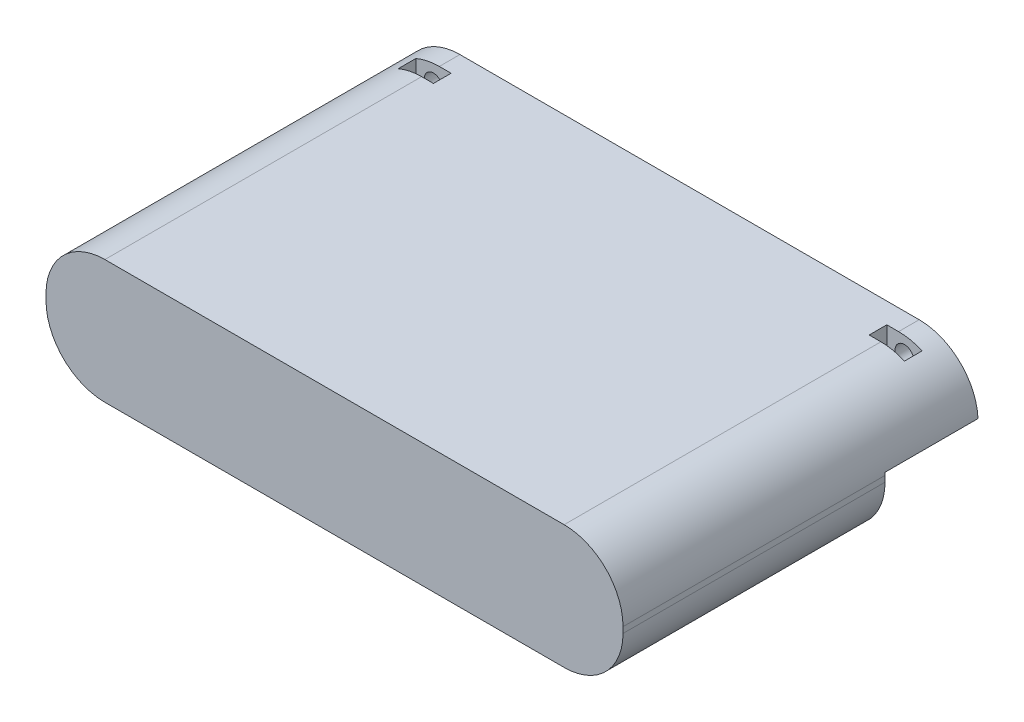
ISO-10303-21;
HEADER;
FILE_DESCRIPTION(('STEP AP214'),'2;1');
FILE_NAME('part.step','',(''),(''),'','','');
FILE_SCHEMA(('AUTOMOTIVE_DESIGN { 1 0 10303 214 1 1 1 1 }'));
ENDSEC;
DATA;
#1=APPLICATION_CONTEXT('core data for automotive mechanical design processes');
#2=APPLICATION_PROTOCOL_DEFINITION('international standard','automotive_design',2000,#1);
#3=PRODUCT_CONTEXT('',#1,'mechanical');
#4=PRODUCT('Part','Part','',(#3));
#5=PRODUCT_RELATED_PRODUCT_CATEGORY('part','',(#4));
#6=PRODUCT_DEFINITION_FORMATION('','',#4);
#7=PRODUCT_DEFINITION_CONTEXT('part definition',#1,'design');
#8=PRODUCT_DEFINITION('design','',#6,#7);
#9=PRODUCT_DEFINITION_SHAPE('','',#8);
#10=(LENGTH_UNIT() NAMED_UNIT(*) SI_UNIT(.MILLI.,.METRE.));
#11=(NAMED_UNIT(*) PLANE_ANGLE_UNIT() SI_UNIT($,.RADIAN.));
#12=(NAMED_UNIT(*) SI_UNIT($,.STERADIAN.) SOLID_ANGLE_UNIT());
#13=UNCERTAINTY_MEASURE_WITH_UNIT(LENGTH_MEASURE(1.E-05),#10,'distance_accuracy_value','');
#14=(GEOMETRIC_REPRESENTATION_CONTEXT(3) GLOBAL_UNCERTAINTY_ASSIGNED_CONTEXT((#13)) GLOBAL_UNIT_ASSIGNED_CONTEXT((#10,
#11,#12)) REPRESENTATION_CONTEXT('',''));
#15=CARTESIAN_POINT('',(0.,0.,0.));
#16=DIRECTION('',(0.,0.,1.));
#17=DIRECTION('',(1.,0.,0.));
#18=AXIS2_PLACEMENT_3D('',#15,#16,#17);
#19=CARTESIAN_POINT('',(-49.,0.,57.8));
#20=DIRECTION('',(1.,0.,0.));
#21=DIRECTION('',(0.,0.,-1.));
#22=AXIS2_PLACEMENT_3D('',#19,#20,#21);
#23=PLANE('',#22);
#24=DIRECTION('',(0.,1.,0.));
#25=VECTOR('',#24,1.);
#26=CARTESIAN_POINT('',(-49.,0.95,15.8));
#27=LINE('',#26,#25);
#28=CARTESIAN_POINT('',(-49.,-0.500000000000002,15.8));
#29=VERTEX_POINT('',#28);
#30=CARTESIAN_POINT('',(-49.,0.499999999999999,15.8));
#31=VERTEX_POINT('',#30);
#32=EDGE_CURVE('E285',#29,#31,#27,.T.);
#33=ORIENTED_EDGE('',*,*,#32,.F.);
#34=DIRECTION('',(0.,0.,-1.));
#35=VECTOR('',#34,1.);
#36=CARTESIAN_POINT('',(-49.,-0.500000000000002,57.8));
#37=LINE('',#36,#35);
#38=CARTESIAN_POINT('',(-49.,-0.500000000000002,60.3));
#39=VERTEX_POINT('',#38);
#40=EDGE_CURVE('E355',#29,#39,#37,.F.);
#41=ORIENTED_EDGE('',*,*,#40,.T.);
#42=DIRECTION('',(0.,-1.,0.));
#43=VECTOR('',#42,1.);
#44=CARTESIAN_POINT('',(-49.,10.5,60.3));
#45=LINE('',#44,#43);
#46=CARTESIAN_POINT('',(-49.,0.499999999999999,60.3));
#47=VERTEX_POINT('',#46);
#48=EDGE_CURVE('E265',#47,#39,#45,.T.);
#49=ORIENTED_EDGE('',*,*,#48,.F.);
#50=DIRECTION('',(0.,0.,-1.));
#51=VECTOR('',#50,1.);
#52=CARTESIAN_POINT('',(-49.,0.499999999999999,0.));
#53=LINE('',#52,#51);
#54=EDGE_CURVE('E329',#47,#31,#53,.T.);
#55=ORIENTED_EDGE('',*,*,#54,.T.);
#56=EDGE_LOOP('',(#33,#41,#49,#55));
#57=FACE_BOUND('',#56,.T.);
#58=ADVANCED_FACE('F37',(#57),#23,.F.);
#59=CARTESIAN_POINT('',(0.,-10.5,57.8));
#60=DIRECTION('',(0.,1.,0.));
#61=DIRECTION('',(0.,0.,1.));
#62=AXIS2_PLACEMENT_3D('',#59,#60,#61);
#63=PLANE('',#62);
#64=DIRECTION('',(-1.,0.,0.));
#65=VECTOR('',#64,1.);
#66=CARTESIAN_POINT('',(-49.,-10.5,15.8));
#67=LINE('',#66,#65);
#68=CARTESIAN_POINT('',(39.,-10.5,15.8));
#69=VERTEX_POINT('',#68);
#70=CARTESIAN_POINT('',(-39.,-10.5,15.8));
#71=VERTEX_POINT('',#70);
#72=EDGE_CURVE('E283',#69,#71,#67,.T.);
#73=ORIENTED_EDGE('',*,*,#72,.F.);
#74=DIRECTION('',(0.,0.,-1.));
#75=VECTOR('',#74,1.);
#76=CARTESIAN_POINT('',(39.,-10.5,60.3));
#77=LINE('',#76,#75);
#78=CARTESIAN_POINT('',(39.,-10.5,60.3));
#79=VERTEX_POINT('',#78);
#80=EDGE_CURVE('E45',#69,#79,#77,.F.);
#81=ORIENTED_EDGE('',*,*,#80,.T.);
#82=DIRECTION('',(1.,0.,0.));
#83=VECTOR('',#82,1.);
#84=CARTESIAN_POINT('',(-49.,-10.5,60.3));
#85=LINE('',#84,#83);
#86=CARTESIAN_POINT('',(-39.,-10.5,60.3));
#87=VERTEX_POINT('',#86);
#88=EDGE_CURVE('E268',#87,#79,#85,.T.);
#89=ORIENTED_EDGE('',*,*,#88,.F.);
#90=DIRECTION('',(0.,0.,-1.));
#91=VECTOR('',#90,1.);
#92=CARTESIAN_POINT('',(-39.,-10.5,57.8));
#93=LINE('',#92,#91);
#94=EDGE_CURVE('E350',#87,#71,#93,.T.);
#95=ORIENTED_EDGE('',*,*,#94,.T.);
#96=EDGE_LOOP('',(#73,#81,#89,#95));
#97=FACE_BOUND('',#96,.T.);
#98=ADVANCED_FACE('F405',(#97),#63,.F.);
#99=CARTESIAN_POINT('',(49.,0.,57.8));
#100=DIRECTION('',(1.,0.,0.));
#101=DIRECTION('',(0.,0.,-1.));
#102=AXIS2_PLACEMENT_3D('',#99,#100,#101);
#103=PLANE('',#102);
#104=DIRECTION('',(0.,1.,0.));
#105=VECTOR('',#104,1.);
#106=CARTESIAN_POINT('',(49.,10.5,60.3));
#107=LINE('',#106,#105);
#108=CARTESIAN_POINT('',(49.,-0.500000000000002,60.3));
#109=VERTEX_POINT('',#108);
#110=CARTESIAN_POINT('',(49.,0.499999999999999,60.3));
#111=VERTEX_POINT('',#110);
#112=EDGE_CURVE('E250',#109,#111,#107,.T.);
#113=ORIENTED_EDGE('',*,*,#112,.F.);
#114=DIRECTION('',(0.,0.,-1.));
#115=VECTOR('',#114,1.);
#116=CARTESIAN_POINT('',(49.,-0.500000000000002,15.8));
#117=LINE('',#116,#115);
#118=CARTESIAN_POINT('',(49.,-0.500000000000002,15.8));
#119=VERTEX_POINT('',#118);
#120=EDGE_CURVE('E359',#109,#119,#117,.T.);
#121=ORIENTED_EDGE('',*,*,#120,.T.);
#122=DIRECTION('',(0.,-1.,0.));
#123=VECTOR('',#122,1.);
#124=CARTESIAN_POINT('',(49.,-10.5,15.8));
#125=LINE('',#124,#123);
#126=CARTESIAN_POINT('',(49.,0.499999999999999,15.8));
#127=VERTEX_POINT('',#126);
#128=EDGE_CURVE('E289',#127,#119,#125,.T.);
#129=ORIENTED_EDGE('',*,*,#128,.F.);
#130=DIRECTION('',(0.,0.,-1.));
#131=VECTOR('',#130,1.);
#132=CARTESIAN_POINT('',(49.,0.499999999999999,57.8));
#133=LINE('',#132,#131);
#134=EDGE_CURVE('E324',#127,#111,#133,.F.);
#135=ORIENTED_EDGE('',*,*,#134,.T.);
#136=EDGE_LOOP('',(#113,#121,#129,#135));
#137=FACE_BOUND('',#136,.T.);
#138=ADVANCED_FACE('F366',(#137),#103,.T.);
#139=CARTESIAN_POINT('',(0.,10.5,57.8));
#140=DIRECTION('',(0.,1.,0.));
#141=DIRECTION('',(0.,0.,1.));
#142=AXIS2_PLACEMENT_3D('',#139,#140,#141);
#143=PLANE('',#142);
#144=DIRECTION('',(1.,0.,0.));
#145=VECTOR('',#144,1.);
#146=CARTESIAN_POINT('',(0.,10.5,0.));
#147=LINE('',#146,#145);
#148=CARTESIAN_POINT('',(-39.,10.5,0.));
#149=VERTEX_POINT('',#148);
#150=CARTESIAN_POINT('',(39.,10.5,0.));
#151=VERTEX_POINT('',#150);
#152=EDGE_CURVE('E291',#149,#151,#147,.T.);
#153=ORIENTED_EDGE('',*,*,#152,.F.);
#154=DIRECTION('',(0.,0.,-1.));
#155=VECTOR('',#154,1.);
#156=CARTESIAN_POINT('',(-39.,10.5,60.3));
#157=LINE('',#156,#155);
#158=CARTESIAN_POINT('',(-39.,10.5,3.5));
#159=VERTEX_POINT('',#158);
#160=EDGE_CURVE('E340',#149,#159,#157,.F.);
#161=ORIENTED_EDGE('',*,*,#160,.T.);
#162=DIRECTION('',(-1.,0.,0.));
#163=VECTOR('',#162,1.);
#164=CARTESIAN_POINT('',(-43.,10.5,3.5));
#165=LINE('',#164,#163);
#166=CARTESIAN_POINT('',(-37.,10.5,3.5));
#167=VERTEX_POINT('',#166);
#168=EDGE_CURVE('E202',#167,#159,#165,.T.);
#169=ORIENTED_EDGE('',*,*,#168,.F.);
#170=DIRECTION('',(0.,0.,-1.));
#171=VECTOR('',#170,1.);
#172=CARTESIAN_POINT('',(-37.,10.5,3.5));
#173=LINE('',#172,#171);
#174=CARTESIAN_POINT('',(-37.,10.5,6.5));
#175=VERTEX_POINT('',#174);
#176=EDGE_CURVE('E181',#175,#167,#173,.T.);
#177=ORIENTED_EDGE('',*,*,#176,.F.);
#178=DIRECTION('',(1.,0.,0.));
#179=VECTOR('',#178,1.);
#180=CARTESIAN_POINT('',(-43.,10.5,6.5));
#181=LINE('',#180,#179);
#182=CARTESIAN_POINT('',(-39.,10.5,6.5));
#183=VERTEX_POINT('',#182);
#184=EDGE_CURVE('E200',#183,#175,#181,.T.);
#185=ORIENTED_EDGE('',*,*,#184,.F.);
#186=DIRECTION('',(0.,0.,-1.));
#187=VECTOR('',#186,1.);
#188=CARTESIAN_POINT('',(-39.,10.5,60.3));
#189=LINE('',#188,#187);
#190=CARTESIAN_POINT('',(-39.,10.5,60.3));
#191=VERTEX_POINT('',#190);
#192=EDGE_CURVE('E338',#183,#191,#189,.F.);
#193=ORIENTED_EDGE('',*,*,#192,.T.);
#194=DIRECTION('',(-1.,0.,0.));
#195=VECTOR('',#194,1.);
#196=CARTESIAN_POINT('',(-49.,10.5,60.3));
#197=LINE('',#196,#195);
#198=CARTESIAN_POINT('',(39.,10.5,60.3));
#199=VERTEX_POINT('',#198);
#200=EDGE_CURVE('E262',#199,#191,#197,.T.);
#201=ORIENTED_EDGE('',*,*,#200,.F.);
#202=DIRECTION('',(0.,0.,-1.));
#203=VECTOR('',#202,1.);
#204=CARTESIAN_POINT('',(39.,10.5,57.8));
#205=LINE('',#204,#203);
#206=CARTESIAN_POINT('',(39.,10.5,6.50000000000003));
#207=VERTEX_POINT('',#206);
#208=EDGE_CURVE('E307',#199,#207,#205,.T.);
#209=ORIENTED_EDGE('',*,*,#208,.T.);
#210=DIRECTION('',(1.,0.,0.));
#211=VECTOR('',#210,1.);
#212=CARTESIAN_POINT('',(43.,10.5,6.50000000000003));
#213=LINE('',#212,#211);
#214=CARTESIAN_POINT('',(37.,10.5,6.50000000000003));
#215=VERTEX_POINT('',#214);
#216=EDGE_CURVE('E221',#215,#207,#213,.T.);
#217=ORIENTED_EDGE('',*,*,#216,.F.);
#218=DIRECTION('',(0.,0.,1.));
#219=VECTOR('',#218,1.);
#220=CARTESIAN_POINT('',(37.,10.5,3.50000000000003));
#221=LINE('',#220,#219);
#222=CARTESIAN_POINT('',(37.,10.5,3.50000000000003));
#223=VERTEX_POINT('',#222);
#224=EDGE_CURVE('E233',#223,#215,#221,.T.);
#225=ORIENTED_EDGE('',*,*,#224,.F.);
#226=DIRECTION('',(-1.,0.,0.));
#227=VECTOR('',#226,1.);
#228=CARTESIAN_POINT('',(43.,10.5,3.50000000000003));
#229=LINE('',#228,#227);
#230=CARTESIAN_POINT('',(39.,10.5,3.50000000000003));
#231=VERTEX_POINT('',#230);
#232=EDGE_CURVE('E231',#231,#223,#229,.T.);
#233=ORIENTED_EDGE('',*,*,#232,.F.);
#234=DIRECTION('',(0.,0.,-1.));
#235=VECTOR('',#234,1.);
#236=CARTESIAN_POINT('',(39.,10.5,57.8));
#237=LINE('',#236,#235);
#238=EDGE_CURVE('E294',#231,#151,#237,.T.);
#239=ORIENTED_EDGE('',*,*,#238,.T.);
#240=EDGE_LOOP('',(#153,#161,#169,#177,#185,#193,#201,#209,#217,#225,#233,#239));
#241=FACE_BOUND('',#240,.T.);
#242=ADVANCED_FACE('F385',(#241),#143,.T.);
#243=CARTESIAN_POINT('',(0.,0.,0.));
#244=DIRECTION('',(0.,0.,1.));
#245=DIRECTION('',(1.,0.,0.));
#246=AXIS2_PLACEMENT_3D('',#243,#244,#245);
#247=PLANE('',#246);
#248=CARTESIAN_POINT('',(40.,7.5,0.));
#249=DIRECTION('',(0.,0.,-1.));
#250=DIRECTION('',(-1.,0.,0.));
#251=AXIS2_PLACEMENT_3D('',#248,#249,#250);
#252=CIRCLE('',#251,1.6);
#253=CARTESIAN_POINT('',(38.4,7.5,0.));
#254=VERTEX_POINT('',#253);
#255=EDGE_CURVE('E251',#254,#254,#252,.T.);
#256=ORIENTED_EDGE('',*,*,#255,.F.);
#257=EDGE_LOOP('',(#256));
#258=FACE_BOUND('',#257,.T.);
#259=CARTESIAN_POINT('',(-40.,7.5,0.));
#260=DIRECTION('',(0.,0.,-1.));
#261=DIRECTION('',(-1.,0.,0.));
#262=AXIS2_PLACEMENT_3D('',#259,#260,#261);
#263=CIRCLE('',#262,1.5341995722684);
#264=CARTESIAN_POINT('',(-41.5341995722684,7.5,0.));
#265=VERTEX_POINT('',#264);
#266=EDGE_CURVE('E257',#265,#265,#263,.T.);
#267=ORIENTED_EDGE('',*,*,#266,.F.);
#268=EDGE_LOOP('',(#267));
#269=FACE_BOUND('',#268,.T.);
#270=DIRECTION('',(1.,0.,0.));
#271=VECTOR('',#270,1.);
#272=CARTESIAN_POINT('',(49.,0.949999999999998,0.));
#273=LINE('',#272,#271);
#274=CARTESIAN_POINT('',(-48.9898698690223,0.95,0.));
#275=VERTEX_POINT('',#274);
#276=CARTESIAN_POINT('',(48.9898698690223,0.949999999999998,0.));
#277=VERTEX_POINT('',#276);
#278=EDGE_CURVE('E274',#275,#277,#273,.T.);
#279=ORIENTED_EDGE('',*,*,#278,.F.);
#280=CARTESIAN_POINT('',(-39.,0.499999999999999,0.));
#281=DIRECTION('',(0.,0.,1.));
#282=DIRECTION('',(1.,0.,0.));
#283=AXIS2_PLACEMENT_3D('',#280,#281,#282);
#284=CIRCLE('',#283,10.);
#285=EDGE_CURVE('E336',#275,#149,#284,.F.);
#286=ORIENTED_EDGE('',*,*,#285,.T.);
#287=ORIENTED_EDGE('',*,*,#152,.T.);
#288=CARTESIAN_POINT('',(39.,0.499999999999999,0.));
#289=DIRECTION('',(0.,0.,1.));
#290=DIRECTION('',(1.,0.,0.));
#291=AXIS2_PLACEMENT_3D('',#288,#289,#290);
#292=CIRCLE('',#291,10.);
#293=EDGE_CURVE('E316',#151,#277,#292,.F.);
#294=ORIENTED_EDGE('',*,*,#293,.T.);
#295=EDGE_LOOP('',(#279,#286,#287,#294));
#296=FACE_BOUND('',#295,.T.);
#297=ADVANCED_FACE('F639',(#258,#269,#296),#247,.F.);
#298=CARTESIAN_POINT('',(49.,0.949999999999998,15.8));
#299=DIRECTION('',(0.,1.,0.));
#300=DIRECTION('',(-1.,0.,0.));
#301=AXIS2_PLACEMENT_3D('',#298,#299,#300);
#302=PLANE('',#301);
#303=DIRECTION('',(1.,0.,0.));
#304=VECTOR('',#303,1.);
#305=CARTESIAN_POINT('',(49.,0.949999999999998,15.8));
#306=LINE('',#305,#304);
#307=CARTESIAN_POINT('',(-48.9898698690223,0.95,15.8));
#308=VERTEX_POINT('',#307);
#309=CARTESIAN_POINT('',(48.9898698690223,0.949999999999998,15.8));
#310=VERTEX_POINT('',#309);
#311=EDGE_CURVE('E287',#308,#310,#306,.T.);
#312=ORIENTED_EDGE('',*,*,#311,.F.);
#313=DIRECTION('',(0.,0.,1.));
#314=VECTOR('',#313,1.);
#315=CARTESIAN_POINT('',(-48.9898698690223,0.95,15.8));
#316=LINE('',#315,#314);
#317=EDGE_CURVE('E334',#308,#275,#316,.F.);
#318=ORIENTED_EDGE('',*,*,#317,.T.);
#319=ORIENTED_EDGE('',*,*,#278,.T.);
#320=DIRECTION('',(0.,0.,-1.));
#321=VECTOR('',#320,1.);
#322=CARTESIAN_POINT('',(48.9898698690223,0.949999999999998,0.));
#323=LINE('',#322,#321);
#324=EDGE_CURVE('E319',#277,#310,#323,.F.);
#325=ORIENTED_EDGE('',*,*,#324,.T.);
#326=EDGE_LOOP('',(#312,#318,#319,#325));
#327=FACE_BOUND('',#326,.T.);
#328=ADVANCED_FACE('F462',(#327),#302,.F.);
#329=CARTESIAN_POINT('',(0.,0.,15.8));
#330=DIRECTION('',(0.,0.,1.));
#331=DIRECTION('',(1.,0.,0.));
#332=AXIS2_PLACEMENT_3D('',#329,#330,#331);
#333=PLANE('',#332);
#334=CARTESIAN_POINT('',(40.,-4.49999999999999,15.8));
#335=DIRECTION('',(0.,0.,-1.));
#336=DIRECTION('',(-1.,0.,0.));
#337=AXIS2_PLACEMENT_3D('',#334,#335,#336);
#338=CIRCLE('',#337,4.1);
#339=CARTESIAN_POINT('',(35.9,-4.49999999999999,15.8));
#340=VERTEX_POINT('',#339);
#341=EDGE_CURVE('E275',#340,#340,#338,.T.);
#342=ORIENTED_EDGE('',*,*,#341,.F.);
#343=EDGE_LOOP('',(#342));
#344=FACE_BOUND('',#343,.T.);
#345=CARTESIAN_POINT('',(-40.,-4.5,15.8));
#346=DIRECTION('',(0.,0.,-1.));
#347=DIRECTION('',(-1.,0.,0.));
#348=AXIS2_PLACEMENT_3D('',#345,#346,#347);
#349=CIRCLE('',#348,4.1);
#350=CARTESIAN_POINT('',(-44.1,-4.5,15.8));
#351=VERTEX_POINT('',#350);
#352=EDGE_CURVE('E270',#351,#351,#349,.T.);
#353=ORIENTED_EDGE('',*,*,#352,.F.);
#354=EDGE_LOOP('',(#353));
#355=FACE_BOUND('',#354,.T.);
#356=ORIENTED_EDGE('',*,*,#128,.T.);
#357=CARTESIAN_POINT('',(39.,-0.500000000000002,15.8));
#358=DIRECTION('',(0.,0.,1.));
#359=DIRECTION('',(1.,0.,0.));
#360=AXIS2_PLACEMENT_3D('',#357,#358,#359);
#361=CIRCLE('',#360,10.);
#362=EDGE_CURVE('E59',#119,#69,#361,.F.);
#363=ORIENTED_EDGE('',*,*,#362,.T.);
#364=ORIENTED_EDGE('',*,*,#72,.T.);
#365=CARTESIAN_POINT('',(-39.,-0.500000000000002,15.8));
#366=DIRECTION('',(0.,0.,1.));
#367=DIRECTION('',(1.,0.,0.));
#368=AXIS2_PLACEMENT_3D('',#365,#366,#367);
#369=CIRCLE('',#368,10.);
#370=EDGE_CURVE('E353',#71,#29,#369,.F.);
#371=ORIENTED_EDGE('',*,*,#370,.T.);
#372=ORIENTED_EDGE('',*,*,#32,.T.);
#373=CARTESIAN_POINT('',(-39.,0.499999999999999,15.8));
#374=DIRECTION('',(0.,0.,1.));
#375=DIRECTION('',(1.,0.,0.));
#376=AXIS2_PLACEMENT_3D('',#373,#374,#375);
#377=CIRCLE('',#376,10.);
#378=EDGE_CURVE('E332',#31,#308,#377,.F.);
#379=ORIENTED_EDGE('',*,*,#378,.T.);
#380=ORIENTED_EDGE('',*,*,#311,.T.);
#381=CARTESIAN_POINT('',(39.,0.499999999999999,15.8));
#382=DIRECTION('',(0.,0.,1.));
#383=DIRECTION('',(1.,0.,0.));
#384=AXIS2_PLACEMENT_3D('',#381,#382,#383);
#385=CIRCLE('',#384,10.);
#386=EDGE_CURVE('E322',#310,#127,#385,.F.);
#387=ORIENTED_EDGE('',*,*,#386,.T.);
#388=EDGE_LOOP('',(#356,#363,#364,#371,#372,#379,#380,#387));
#389=FACE_BOUND('',#388,.T.);
#390=ADVANCED_FACE('F370',(#344,#355,#389),#333,.F.);
#391=CARTESIAN_POINT('',(-40.,-4.5,57.8));
#392=DIRECTION('',(0.,0.,-1.));
#393=DIRECTION('',(-1.,0.,0.));
#394=AXIS2_PLACEMENT_3D('',#391,#392,#393);
#395=CYLINDRICAL_SURFACE('',#394,4.1);
#396=CARTESIAN_POINT('',(-40.,-4.5,57.8));
#397=DIRECTION('',(0.,0.,-1.));
#398=DIRECTION('',(-1.,0.,0.));
#399=AXIS2_PLACEMENT_3D('',#396,#397,#398);
#400=CIRCLE('',#399,4.1);
#401=CARTESIAN_POINT('',(-44.1,-4.5,57.8));
#402=VERTEX_POINT('',#401);
#403=EDGE_CURVE('E278',#402,#402,#400,.T.);
#404=CARTESIAN_POINT('',(-44.1,-4.5,57.8));
#405=CARTESIAN_POINT('',(-44.1,-4.5,57.3625));
#406=CARTESIAN_POINT('',(-44.1,-4.5,56.925));
#407=CARTESIAN_POINT('',(-44.1,-4.5,56.05));
#408=CARTESIAN_POINT('',(-44.1,-4.5,55.6125));
#409=CARTESIAN_POINT('',(-44.1,-4.5,54.7375));
#410=CARTESIAN_POINT('',(-44.1,-4.5,54.3));
#411=CARTESIAN_POINT('',(-44.1,-4.5,53.425));
#412=CARTESIAN_POINT('',(-44.1,-4.5,52.9875));
#413=CARTESIAN_POINT('',(-44.1,-4.5,52.1125));
#414=CARTESIAN_POINT('',(-44.1,-4.5,51.675));
#415=CARTESIAN_POINT('',(-44.1,-4.5,50.8));
#416=CARTESIAN_POINT('',(-44.1,-4.5,50.3625));
#417=CARTESIAN_POINT('',(-44.1,-4.5,49.4875));
#418=CARTESIAN_POINT('',(-44.1,-4.5,49.05));
#419=CARTESIAN_POINT('',(-44.1,-4.5,48.175));
#420=CARTESIAN_POINT('',(-44.1,-4.5,47.7375));
#421=CARTESIAN_POINT('',(-44.1,-4.5,46.8625));
#422=CARTESIAN_POINT('',(-44.1,-4.5,46.425));
#423=CARTESIAN_POINT('',(-44.1,-4.5,45.55));
#424=CARTESIAN_POINT('',(-44.1,-4.5,45.1125));
#425=CARTESIAN_POINT('',(-44.1,-4.5,44.2375));
#426=CARTESIAN_POINT('',(-44.1,-4.5,43.8));
#427=CARTESIAN_POINT('',(-44.1,-4.5,42.925));
#428=CARTESIAN_POINT('',(-44.1,-4.5,42.4875));
#429=CARTESIAN_POINT('',(-44.1,-4.5,41.6125));
#430=CARTESIAN_POINT('',(-44.1,-4.5,41.175));
#431=CARTESIAN_POINT('',(-44.1,-4.5,40.3));
#432=CARTESIAN_POINT('',(-44.1,-4.5,39.8625));
#433=CARTESIAN_POINT('',(-44.1,-4.5,38.9875));
#434=CARTESIAN_POINT('',(-44.1,-4.5,38.55));
#435=CARTESIAN_POINT('',(-44.1,-4.5,37.675));
#436=CARTESIAN_POINT('',(-44.1,-4.5,37.2375));
#437=CARTESIAN_POINT('',(-44.1,-4.5,36.3625));
#438=CARTESIAN_POINT('',(-44.1,-4.5,35.925));
#439=CARTESIAN_POINT('',(-44.1,-4.5,35.05));
#440=CARTESIAN_POINT('',(-44.1,-4.5,34.6125));
#441=CARTESIAN_POINT('',(-44.1,-4.5,33.7375));
#442=CARTESIAN_POINT('',(-44.1,-4.5,33.3));
#443=CARTESIAN_POINT('',(-44.1,-4.5,32.425));
#444=CARTESIAN_POINT('',(-44.1,-4.5,31.9875));
#445=CARTESIAN_POINT('',(-44.1,-4.5,31.1125));
#446=CARTESIAN_POINT('',(-44.1,-4.5,30.675));
#447=CARTESIAN_POINT('',(-44.1,-4.5,29.8));
#448=CARTESIAN_POINT('',(-44.1,-4.5,29.3625));
#449=CARTESIAN_POINT('',(-44.1,-4.5,28.4875));
#450=CARTESIAN_POINT('',(-44.1,-4.5,28.05));
#451=CARTESIAN_POINT('',(-44.1,-4.5,27.175));
#452=CARTESIAN_POINT('',(-44.1,-4.5,26.7375));
#453=CARTESIAN_POINT('',(-44.1,-4.5,25.8625));
#454=CARTESIAN_POINT('',(-44.1,-4.5,25.425));
#455=CARTESIAN_POINT('',(-44.1,-4.5,24.55));
#456=CARTESIAN_POINT('',(-44.1,-4.5,24.1125));
#457=CARTESIAN_POINT('',(-44.1,-4.5,23.2375));
#458=CARTESIAN_POINT('',(-44.1,-4.5,22.8));
#459=CARTESIAN_POINT('',(-44.1,-4.5,21.925));
#460=CARTESIAN_POINT('',(-44.1,-4.5,21.4875));
#461=CARTESIAN_POINT('',(-44.1,-4.5,20.6125));
#462=CARTESIAN_POINT('',(-44.1,-4.5,20.175));
#463=CARTESIAN_POINT('',(-44.1,-4.5,19.3));
#464=CARTESIAN_POINT('',(-44.1,-4.5,18.8625));
#465=CARTESIAN_POINT('',(-44.1,-4.5,17.9875));
#466=CARTESIAN_POINT('',(-44.1,-4.5,17.55));
#467=CARTESIAN_POINT('',(-44.1,-4.5,16.675));
#468=CARTESIAN_POINT('',(-44.1,-4.5,16.2375));
#469=CARTESIAN_POINT('',(-44.1,-4.5,15.8));
#470=B_SPLINE_CURVE_WITH_KNOTS('',3,(#404,#405,#406,#407,#408,#409,#410,#411,#412,#413,#414,
#415,#416,#417,#418,#419,#420,#421,#422,#423,#424,#425,#426,#427,#428,#429,#430,#431,#432,#433,
#434,#435,#436,#437,#438,#439,#440,#441,#442,#443,#444,#445,#446,#447,#448,#449,#450,#451,#452,
#453,#454,#455,#456,#457,#458,#459,#460,#461,#462,#463,#464,#465,#466,#467,#468,#469),
.UNSPECIFIED.,.F.,.F.,(4,2,2,2,2,2,2,2,2,2,2,2,2,2,2,2,2,2,2,2,2,2,2,2,2,2,2,2,2,2,2,2,4),(0.,
1.31249999999999,2.625,3.9375,5.25,6.5625,7.87499999999999,9.18749999999999,10.5,11.8125,13.125,
14.4375,15.75,17.0625,18.375,19.6875,21.,22.3125,23.625,24.9375,26.25,27.5625,28.875,30.1875,
31.5,32.8125,34.125,35.4375,36.75,38.0625,39.375,40.6875,42.),.UNSPECIFIED.);
#471=EDGE_CURVE('BSEAM461',#402,#351,#470,.T.);
#472=ORIENTED_EDGE('',*,*,#403,.F.);
#473=ORIENTED_EDGE('',*,*,#352,.T.);
#474=ORIENTED_EDGE('',*,*,#471,.T.);
#475=ORIENTED_EDGE('',*,*,#471,.F.);
#476=EDGE_LOOP('',(#472,#474,#473,#475));
#477=FACE_BOUND('',#476,.T.);
#478=ADVANCED_FACE('F461',(#477),#395,.F.);
#479=CARTESIAN_POINT('',(40.,-4.49999999999999,57.8));
#480=DIRECTION('',(0.,0.,-1.));
#481=DIRECTION('',(-1.,0.,0.));
#482=AXIS2_PLACEMENT_3D('',#479,#480,#481);
#483=CYLINDRICAL_SURFACE('',#482,4.1);
#484=CARTESIAN_POINT('',(40.,-4.49999999999999,57.8));
#485=DIRECTION('',(0.,0.,-1.));
#486=DIRECTION('',(-1.,0.,0.));
#487=AXIS2_PLACEMENT_3D('',#484,#485,#486);
#488=CIRCLE('',#487,4.1);
#489=CARTESIAN_POINT('',(35.9,-4.49999999999999,57.8));
#490=VERTEX_POINT('',#489);
#491=EDGE_CURVE('E271',#490,#490,#488,.T.);
#492=CARTESIAN_POINT('',(35.9,-4.49999999999999,57.8));
#493=CARTESIAN_POINT('',(35.9,-4.49999999999999,57.3625));
#494=CARTESIAN_POINT('',(35.9,-4.49999999999999,56.925));
#495=CARTESIAN_POINT('',(35.9,-4.49999999999999,56.05));
#496=CARTESIAN_POINT('',(35.9,-4.49999999999999,55.6125));
#497=CARTESIAN_POINT('',(35.9,-4.49999999999999,54.7375));
#498=CARTESIAN_POINT('',(35.9,-4.49999999999999,54.3));
#499=CARTESIAN_POINT('',(35.9,-4.49999999999999,53.425));
#500=CARTESIAN_POINT('',(35.9,-4.49999999999999,52.9875));
#501=CARTESIAN_POINT('',(35.9,-4.49999999999999,52.1125));
#502=CARTESIAN_POINT('',(35.9,-4.49999999999999,51.675));
#503=CARTESIAN_POINT('',(35.9,-4.49999999999999,50.8));
#504=CARTESIAN_POINT('',(35.9,-4.49999999999999,50.3625));
#505=CARTESIAN_POINT('',(35.9,-4.49999999999999,49.4875));
#506=CARTESIAN_POINT('',(35.9,-4.49999999999999,49.05));
#507=CARTESIAN_POINT('',(35.9,-4.49999999999999,48.175));
#508=CARTESIAN_POINT('',(35.9,-4.49999999999999,47.7375));
#509=CARTESIAN_POINT('',(35.9,-4.49999999999999,46.8625));
#510=CARTESIAN_POINT('',(35.9,-4.49999999999999,46.425));
#511=CARTESIAN_POINT('',(35.9,-4.49999999999999,45.55));
#512=CARTESIAN_POINT('',(35.9,-4.49999999999999,45.1125));
#513=CARTESIAN_POINT('',(35.9,-4.49999999999999,44.2375));
#514=CARTESIAN_POINT('',(35.9,-4.49999999999999,43.8));
#515=CARTESIAN_POINT('',(35.9,-4.49999999999999,42.925));
#516=CARTESIAN_POINT('',(35.9,-4.49999999999999,42.4875));
#517=CARTESIAN_POINT('',(35.9,-4.49999999999999,41.6125));
#518=CARTESIAN_POINT('',(35.9,-4.49999999999999,41.175));
#519=CARTESIAN_POINT('',(35.9,-4.49999999999999,40.3));
#520=CARTESIAN_POINT('',(35.9,-4.49999999999999,39.8625));
#521=CARTESIAN_POINT('',(35.9,-4.49999999999999,38.9875));
#522=CARTESIAN_POINT('',(35.9,-4.49999999999999,38.55));
#523=CARTESIAN_POINT('',(35.9,-4.49999999999999,37.675));
#524=CARTESIAN_POINT('',(35.9,-4.49999999999999,37.2375));
#525=CARTESIAN_POINT('',(35.9,-4.49999999999999,36.3625));
#526=CARTESIAN_POINT('',(35.9,-4.49999999999999,35.925));
#527=CARTESIAN_POINT('',(35.9,-4.49999999999999,35.05));
#528=CARTESIAN_POINT('',(35.9,-4.49999999999999,34.6125));
#529=CARTESIAN_POINT('',(35.9,-4.49999999999999,33.7375));
#530=CARTESIAN_POINT('',(35.9,-4.49999999999999,33.3));
#531=CARTESIAN_POINT('',(35.9,-4.49999999999999,32.425));
#532=CARTESIAN_POINT('',(35.9,-4.49999999999999,31.9875));
#533=CARTESIAN_POINT('',(35.9,-4.49999999999999,31.1125));
#534=CARTESIAN_POINT('',(35.9,-4.49999999999999,30.675));
#535=CARTESIAN_POINT('',(35.9,-4.49999999999999,29.8));
#536=CARTESIAN_POINT('',(35.9,-4.49999999999999,29.3625));
#537=CARTESIAN_POINT('',(35.9,-4.49999999999999,28.4875));
#538=CARTESIAN_POINT('',(35.9,-4.49999999999999,28.05));
#539=CARTESIAN_POINT('',(35.9,-4.49999999999999,27.175));
#540=CARTESIAN_POINT('',(35.9,-4.49999999999999,26.7375));
#541=CARTESIAN_POINT('',(35.9,-4.49999999999999,25.8625));
#542=CARTESIAN_POINT('',(35.9,-4.49999999999999,25.425));
#543=CARTESIAN_POINT('',(35.9,-4.49999999999999,24.55));
#544=CARTESIAN_POINT('',(35.9,-4.49999999999999,24.1125));
#545=CARTESIAN_POINT('',(35.9,-4.49999999999999,23.2375));
#546=CARTESIAN_POINT('',(35.9,-4.49999999999999,22.8));
#547=CARTESIAN_POINT('',(35.9,-4.49999999999999,21.925));
#548=CARTESIAN_POINT('',(35.9,-4.49999999999999,21.4875));
#549=CARTESIAN_POINT('',(35.9,-4.49999999999999,20.6125));
#550=CARTESIAN_POINT('',(35.9,-4.49999999999999,20.175));
#551=CARTESIAN_POINT('',(35.9,-4.49999999999999,19.3));
#552=CARTESIAN_POINT('',(35.9,-4.49999999999999,18.8625));
#553=CARTESIAN_POINT('',(35.9,-4.49999999999999,17.9875));
#554=CARTESIAN_POINT('',(35.9,-4.49999999999999,17.55));
#555=CARTESIAN_POINT('',(35.9,-4.49999999999999,16.675));
#556=CARTESIAN_POINT('',(35.9,-4.49999999999999,16.2375));
#557=CARTESIAN_POINT('',(35.9,-4.49999999999999,15.8));
#558=B_SPLINE_CURVE_WITH_KNOTS('',3,(#492,#493,#494,#495,#496,#497,#498,#499,#500,#501,#502,
#503,#504,#505,#506,#507,#508,#509,#510,#511,#512,#513,#514,#515,#516,#517,#518,#519,#520,#521,
#522,#523,#524,#525,#526,#527,#528,#529,#530,#531,#532,#533,#534,#535,#536,#537,#538,#539,#540,
#541,#542,#543,#544,#545,#546,#547,#548,#549,#550,#551,#552,#553,#554,#555,#556,#557),
.UNSPECIFIED.,.F.,.F.,(4,2,2,2,2,2,2,2,2,2,2,2,2,2,2,2,2,2,2,2,2,2,2,2,2,2,2,2,2,2,2,2,4),(0.,
1.31249999999999,2.625,3.9375,5.25,6.5625,7.87499999999999,9.18749999999999,10.5,11.8125,13.125,
14.4375,15.75,17.0625,18.375,19.6875,21.,22.3125,23.625,24.9375,26.25,27.5625,28.875,30.1875,
31.5,32.8125,34.125,35.4375,36.75,38.0625,39.375,40.6875,42.),.UNSPECIFIED.);
#559=EDGE_CURVE('BSEAM663',#490,#340,#558,.T.);
#560=ORIENTED_EDGE('',*,*,#491,.F.);
#561=ORIENTED_EDGE('',*,*,#341,.T.);
#562=ORIENTED_EDGE('',*,*,#559,.T.);
#563=ORIENTED_EDGE('',*,*,#559,.F.);
#564=EDGE_LOOP('',(#560,#562,#561,#563));
#565=FACE_BOUND('',#564,.T.);
#566=ADVANCED_FACE('F663',(#565),#483,.F.);
#567=CARTESIAN_POINT('',(0.,0.,57.8));
#568=DIRECTION('',(0.,0.,1.));
#569=DIRECTION('',(1.,0.,0.));
#570=AXIS2_PLACEMENT_3D('',#567,#568,#569);
#571=PLANE('',#570);
#572=ORIENTED_EDGE('',*,*,#403,.T.);
#573=EDGE_LOOP('',(#572));
#574=FACE_BOUND('',#573,.T.);
#575=ADVANCED_FACE('F667',(#574),#571,.F.);
#576=ORIENTED_EDGE('',*,*,#491,.T.);
#577=EDGE_LOOP('',(#576));
#578=FACE_BOUND('',#577,.T.);
#579=ADVANCED_FACE('F476',(#578),#571,.F.);
#580=CARTESIAN_POINT('',(0.,0.,60.3));
#581=DIRECTION('',(0.,0.,1.));
#582=DIRECTION('',(1.,0.,0.));
#583=AXIS2_PLACEMENT_3D('',#580,#581,#582);
#584=PLANE('',#583);
#585=ORIENTED_EDGE('',*,*,#88,.T.);
#586=CARTESIAN_POINT('',(39.,-0.500000000000002,60.3));
#587=DIRECTION('',(0.,0.,1.));
#588=DIRECTION('',(1.,0.,0.));
#589=AXIS2_PLACEMENT_3D('',#586,#587,#588);
#590=CIRCLE('',#589,10.);
#591=EDGE_CURVE('E11',#79,#109,#590,.T.);
#592=ORIENTED_EDGE('',*,*,#591,.T.);
#593=ORIENTED_EDGE('',*,*,#112,.T.);
#594=CARTESIAN_POINT('',(39.,0.499999999999999,60.3));
#595=DIRECTION('',(0.,0.,1.));
#596=DIRECTION('',(1.,0.,0.));
#597=AXIS2_PLACEMENT_3D('',#594,#595,#596);
#598=CIRCLE('',#597,10.);
#599=EDGE_CURVE('E327',#111,#199,#598,.T.);
#600=ORIENTED_EDGE('',*,*,#599,.T.);
#601=ORIENTED_EDGE('',*,*,#200,.T.);
#602=CARTESIAN_POINT('',(-39.,0.499999999999999,60.3));
#603=DIRECTION('',(0.,0.,1.));
#604=DIRECTION('',(1.,0.,0.));
#605=AXIS2_PLACEMENT_3D('',#602,#603,#604);
#606=CIRCLE('',#605,10.);
#607=EDGE_CURVE('E348',#191,#47,#606,.T.);
#608=ORIENTED_EDGE('',*,*,#607,.T.);
#609=ORIENTED_EDGE('',*,*,#48,.T.);
#610=CARTESIAN_POINT('',(-39.,-0.500000000000002,60.3));
#611=DIRECTION('',(0.,0.,1.));
#612=DIRECTION('',(1.,0.,0.));
#613=AXIS2_PLACEMENT_3D('',#610,#611,#612);
#614=CIRCLE('',#613,10.);
#615=EDGE_CURVE('E357',#39,#87,#614,.T.);
#616=ORIENTED_EDGE('',*,*,#615,.T.);
#617=EDGE_LOOP('',(#585,#592,#593,#600,#601,#608,#609,#616));
#618=FACE_BOUND('',#617,.T.);
#619=ADVANCED_FACE('F381',(#618),#584,.T.);
#620=CARTESIAN_POINT('',(-40.,7.5,10.));
#621=DIRECTION('',(0.,0.,-1.));
#622=DIRECTION('',(-1.,0.,0.));
#623=AXIS2_PLACEMENT_3D('',#620,#621,#622);
#624=CYLINDRICAL_SURFACE('',#623,1.5341995722684);
#625=CARTESIAN_POINT('',(-40.,7.5,3.5));
#626=DIRECTION('',(0.,0.,-1.));
#627=DIRECTION('',(-1.,0.,0.));
#628=AXIS2_PLACEMENT_3D('',#625,#626,#627);
#629=CIRCLE('',#628,1.5341995722684);
#630=CARTESIAN_POINT('',(-41.5341995722684,7.5,3.5));
#631=VERTEX_POINT('',#630);
#632=EDGE_CURVE('E300',#631,#631,#629,.F.);
#633=ORIENTED_EDGE('',*,*,#632,.T.);
#634=EDGE_LOOP('',(#633));
#635=FACE_BOUND('',#634,.T.);
#636=ORIENTED_EDGE('',*,*,#266,.T.);
#637=EDGE_LOOP('',(#636));
#638=FACE_BOUND('',#637,.T.);
#639=ADVANCED_FACE('F475',(#635,#638),#624,.F.);
#640=CARTESIAN_POINT('',(40.,7.5,10.));
#641=DIRECTION('',(0.,0.,-1.));
#642=DIRECTION('',(-1.,0.,0.));
#643=AXIS2_PLACEMENT_3D('',#640,#641,#642);
#644=CYLINDRICAL_SURFACE('',#643,1.6);
#645=CARTESIAN_POINT('',(40.,7.5,3.50000000000003));
#646=DIRECTION('',(0.,0.,-1.));
#647=DIRECTION('',(-1.,0.,0.));
#648=AXIS2_PLACEMENT_3D('',#645,#646,#647);
#649=CIRCLE('',#648,1.6);
#650=CARTESIAN_POINT('',(38.4,7.5,3.50000000000003));
#651=VERTEX_POINT('',#650);
#652=EDGE_CURVE('E212',#651,#651,#649,.F.);
#653=ORIENTED_EDGE('',*,*,#652,.T.);
#654=EDGE_LOOP('',(#653));
#655=FACE_BOUND('',#654,.T.);
#656=ORIENTED_EDGE('',*,*,#255,.T.);
#657=EDGE_LOOP('',(#656));
#658=FACE_BOUND('',#657,.T.);
#659=ADVANCED_FACE('F494',(#655,#658),#644,.F.);
#660=CARTESIAN_POINT('',(43.,3.5,6.50000000000003));
#661=DIRECTION('',(0.,0.,1.));
#662=DIRECTION('',(1.,0.,0.));
#663=AXIS2_PLACEMENT_3D('',#660,#661,#662);
#664=PLANE('',#663);
#665=ORIENTED_EDGE('',*,*,#216,.T.);
#666=CARTESIAN_POINT('',(39.,0.499999999999999,6.50000000000003));
#667=DIRECTION('',(0.,0.,1.));
#668=DIRECTION('',(1.,0.,0.));
#669=AXIS2_PLACEMENT_3D('',#666,#667,#668);
#670=CIRCLE('',#669,10.);
#671=CARTESIAN_POINT('',(43.,9.66515138991167,6.50000000000003));
#672=VERTEX_POINT('',#671);
#673=EDGE_CURVE('E310',#207,#672,#670,.F.);
#674=ORIENTED_EDGE('',*,*,#673,.T.);
#675=DIRECTION('',(0.,1.,0.));
#676=VECTOR('',#675,1.);
#677=CARTESIAN_POINT('',(43.,3.5,6.50000000000003));
#678=LINE('',#677,#676);
#679=CARTESIAN_POINT('',(43.,3.5,6.50000000000003));
#680=VERTEX_POINT('',#679);
#681=EDGE_CURVE('E208',#680,#672,#678,.T.);
#682=ORIENTED_EDGE('',*,*,#681,.F.);
#683=DIRECTION('',(1.,0.,0.));
#684=VECTOR('',#683,1.);
#685=CARTESIAN_POINT('',(43.,3.5,6.50000000000003));
#686=LINE('',#685,#684);
#687=CARTESIAN_POINT('',(37.,3.5,6.50000000000003));
#688=VERTEX_POINT('',#687);
#689=EDGE_CURVE('E227',#688,#680,#686,.T.);
#690=ORIENTED_EDGE('',*,*,#689,.F.);
#691=DIRECTION('',(0.,1.,0.));
#692=VECTOR('',#691,1.);
#693=CARTESIAN_POINT('',(37.,3.5,6.50000000000003));
#694=LINE('',#693,#692);
#695=EDGE_CURVE('E240',#688,#215,#694,.T.);
#696=ORIENTED_EDGE('',*,*,#695,.T.);
#697=EDGE_LOOP('',(#665,#674,#682,#690,#696));
#698=FACE_BOUND('',#697,.T.);
#699=CARTESIAN_POINT('',(40.,7.5,6.50000000000003));
#700=DIRECTION('',(0.,0.,1.));
#701=DIRECTION('',(1.,0.,0.));
#702=AXIS2_PLACEMENT_3D('',#699,#700,#701);
#703=CIRCLE('',#702,1.6);
#704=CARTESIAN_POINT('',(41.6,7.5,6.50000000000003));
#705=VERTEX_POINT('',#704);
#706=EDGE_CURVE('E297',#705,#705,#703,.F.);
#707=ORIENTED_EDGE('',*,*,#706,.F.);
#708=EDGE_LOOP('',(#707));
#709=FACE_BOUND('',#708,.T.);
#710=ADVANCED_FACE('F502',(#698,#709),#664,.F.);
#711=CARTESIAN_POINT('',(43.,3.5,3.50000000000003));
#712=DIRECTION('',(0.,0.,-1.));
#713=DIRECTION('',(-1.,0.,0.));
#714=AXIS2_PLACEMENT_3D('',#711,#712,#713);
#715=PLANE('',#714);
#716=DIRECTION('',(0.,1.,0.));
#717=VECTOR('',#716,1.);
#718=CARTESIAN_POINT('',(43.,3.5,3.50000000000003));
#719=LINE('',#718,#717);
#720=CARTESIAN_POINT('',(43.,3.5,3.50000000000003));
#721=VERTEX_POINT('',#720);
#722=CARTESIAN_POINT('',(43.,9.66515138991167,3.50000000000003));
#723=VERTEX_POINT('',#722);
#724=EDGE_CURVE('E230',#721,#723,#719,.T.);
#725=ORIENTED_EDGE('',*,*,#724,.T.);
#726=CARTESIAN_POINT('',(39.,0.499999999999999,3.50000000000003));
#727=DIRECTION('',(0.,0.,-1.));
#728=DIRECTION('',(-1.,0.,0.));
#729=AXIS2_PLACEMENT_3D('',#726,#727,#728);
#730=CIRCLE('',#729,10.);
#731=EDGE_CURVE('E314',#723,#231,#730,.F.);
#732=ORIENTED_EDGE('',*,*,#731,.T.);
#733=ORIENTED_EDGE('',*,*,#232,.T.);
#734=DIRECTION('',(0.,1.,0.));
#735=VECTOR('',#734,1.);
#736=CARTESIAN_POINT('',(37.,3.5,3.50000000000003));
#737=LINE('',#736,#735);
#738=CARTESIAN_POINT('',(37.,3.5,3.50000000000003));
#739=VERTEX_POINT('',#738);
#740=EDGE_CURVE('E242',#739,#223,#737,.T.);
#741=ORIENTED_EDGE('',*,*,#740,.F.);
#742=DIRECTION('',(-1.,0.,0.));
#743=VECTOR('',#742,1.);
#744=CARTESIAN_POINT('',(43.,3.5,3.50000000000003));
#745=LINE('',#744,#743);
#746=EDGE_CURVE('E220',#721,#739,#745,.T.);
#747=ORIENTED_EDGE('',*,*,#746,.F.);
#748=EDGE_LOOP('',(#725,#732,#733,#741,#747));
#749=FACE_BOUND('',#748,.T.);
#750=ORIENTED_EDGE('',*,*,#652,.F.);
#751=EDGE_LOOP('',(#750));
#752=FACE_BOUND('',#751,.T.);
#753=ADVANCED_FACE('F512',(#749,#752),#715,.F.);
#754=CARTESIAN_POINT('',(43.,3.5,3.50000000000003));
#755=DIRECTION('',(1.,0.,0.));
#756=DIRECTION('',(0.,0.,-1.));
#757=AXIS2_PLACEMENT_3D('',#754,#755,#756);
#758=PLANE('',#757);
#759=ORIENTED_EDGE('',*,*,#681,.T.);
#760=DIRECTION('',(0.,0.,-1.));
#761=VECTOR('',#760,1.);
#762=CARTESIAN_POINT('',(43.,9.66515138991167,6.50000000000003));
#763=LINE('',#762,#761);
#764=EDGE_CURVE('E312',#672,#723,#763,.T.);
#765=ORIENTED_EDGE('',*,*,#764,.T.);
#766=ORIENTED_EDGE('',*,*,#724,.F.);
#767=DIRECTION('',(0.,0.,-1.));
#768=VECTOR('',#767,1.);
#769=CARTESIAN_POINT('',(43.,3.5,3.50000000000003));
#770=LINE('',#769,#768);
#771=EDGE_CURVE('E217',#680,#721,#770,.T.);
#772=ORIENTED_EDGE('',*,*,#771,.F.);
#773=EDGE_LOOP('',(#759,#765,#766,#772));
#774=FACE_BOUND('',#773,.T.);
#775=ADVANCED_FACE('F521',(#774),#758,.F.);
#776=CARTESIAN_POINT('',(37.,3.5,3.50000000000003));
#777=DIRECTION('',(-1.,0.,0.));
#778=DIRECTION('',(0.,0.,1.));
#779=AXIS2_PLACEMENT_3D('',#776,#777,#778);
#780=PLANE('',#779);
#781=ORIENTED_EDGE('',*,*,#224,.T.);
#782=ORIENTED_EDGE('',*,*,#695,.F.);
#783=DIRECTION('',(0.,0.,1.));
#784=VECTOR('',#783,1.);
#785=CARTESIAN_POINT('',(37.,3.5,3.50000000000003));
#786=LINE('',#785,#784);
#787=EDGE_CURVE('E224',#739,#688,#786,.T.);
#788=ORIENTED_EDGE('',*,*,#787,.F.);
#789=ORIENTED_EDGE('',*,*,#740,.T.);
#790=EDGE_LOOP('',(#781,#782,#788,#789));
#791=FACE_BOUND('',#790,.T.);
#792=ADVANCED_FACE('F529',(#791),#780,.F.);
#793=CARTESIAN_POINT('',(0.,3.5,0.));
#794=DIRECTION('',(0.,-1.,0.));
#795=DIRECTION('',(0.,0.,-1.));
#796=AXIS2_PLACEMENT_3D('',#793,#794,#795);
#797=PLANE('',#796);
#798=ORIENTED_EDGE('',*,*,#771,.T.);
#799=ORIENTED_EDGE('',*,*,#746,.T.);
#800=ORIENTED_EDGE('',*,*,#787,.T.);
#801=ORIENTED_EDGE('',*,*,#689,.T.);
#802=EDGE_LOOP('',(#798,#799,#800,#801));
#803=FACE_BOUND('',#802,.T.);
#804=ADVANCED_FACE('F536',(#803),#797,.F.);
#805=CARTESIAN_POINT('',(40.,7.5,10.));
#806=DIRECTION('',(0.,0.,-1.));
#807=DIRECTION('',(-1.,0.,0.));
#808=AXIS2_PLACEMENT_3D('',#805,#806,#807);
#809=PLANE('',#808);
#810=CARTESIAN_POINT('',(40.,7.5,10.));
#811=DIRECTION('',(0.,0.,-1.));
#812=DIRECTION('',(-1.,0.,0.));
#813=AXIS2_PLACEMENT_3D('',#810,#811,#812);
#814=CIRCLE('',#813,1.6);
#815=CARTESIAN_POINT('',(38.4,7.5,10.));
#816=VERTEX_POINT('',#815);
#817=EDGE_CURVE('E247',#816,#816,#814,.T.);
#818=ORIENTED_EDGE('',*,*,#817,.T.);
#819=EDGE_LOOP('',(#818));
#820=FACE_BOUND('',#819,.T.);
#821=ADVANCED_FACE('F544',(#820),#809,.T.);
#822=ORIENTED_EDGE('',*,*,#706,.T.);
#823=EDGE_LOOP('',(#822));
#824=FACE_BOUND('',#823,.T.);
#825=ORIENTED_EDGE('',*,*,#817,.F.);
#826=EDGE_LOOP('',(#825));
#827=FACE_BOUND('',#826,.T.);
#828=ADVANCED_FACE('F505',(#824,#827),#644,.F.);
#829=CARTESIAN_POINT('',(-43.,3.5,6.5));
#830=DIRECTION('',(0.,0.,1.));
#831=DIRECTION('',(1.,0.,0.));
#832=AXIS2_PLACEMENT_3D('',#829,#830,#831);
#833=PLANE('',#832);
#834=DIRECTION('',(0.,1.,0.));
#835=VECTOR('',#834,1.);
#836=CARTESIAN_POINT('',(-43.,3.5,6.5));
#837=LINE('',#836,#835);
#838=CARTESIAN_POINT('',(-43.,3.5,6.5));
#839=VERTEX_POINT('',#838);
#840=CARTESIAN_POINT('',(-43.,9.66515138991168,6.5));
#841=VERTEX_POINT('',#840);
#842=EDGE_CURVE('E213',#839,#841,#837,.T.);
#843=ORIENTED_EDGE('',*,*,#842,.T.);
#844=CARTESIAN_POINT('',(-39.,0.499999999999999,6.5));
#845=DIRECTION('',(0.,0.,1.));
#846=DIRECTION('',(1.,0.,0.));
#847=AXIS2_PLACEMENT_3D('',#844,#845,#846);
#848=CIRCLE('',#847,10.);
#849=EDGE_CURVE('E346',#841,#183,#848,.F.);
#850=ORIENTED_EDGE('',*,*,#849,.T.);
#851=ORIENTED_EDGE('',*,*,#184,.T.);
#852=DIRECTION('',(0.,1.,0.));
#853=VECTOR('',#852,1.);
#854=CARTESIAN_POINT('',(-37.,3.5,6.5));
#855=LINE('',#854,#853);
#856=CARTESIAN_POINT('',(-37.,3.5,6.5));
#857=VERTEX_POINT('',#856);
#858=EDGE_CURVE('E210',#857,#175,#855,.T.);
#859=ORIENTED_EDGE('',*,*,#858,.F.);
#860=DIRECTION('',(1.,0.,0.));
#861=VECTOR('',#860,1.);
#862=CARTESIAN_POINT('',(-43.,3.5,6.5));
#863=LINE('',#862,#861);
#864=EDGE_CURVE('E186',#839,#857,#863,.T.);
#865=ORIENTED_EDGE('',*,*,#864,.F.);
#866=EDGE_LOOP('',(#843,#850,#851,#859,#865));
#867=FACE_BOUND('',#866,.T.);
#868=CARTESIAN_POINT('',(-40.,7.5,6.5));
#869=DIRECTION('',(0.,0.,1.));
#870=DIRECTION('',(1.,0.,0.));
#871=AXIS2_PLACEMENT_3D('',#868,#869,#870);
#872=CIRCLE('',#871,1.5341995722684);
#873=CARTESIAN_POINT('',(-38.4658004277316,7.5,6.5));
#874=VERTEX_POINT('',#873);
#875=EDGE_CURVE('E260',#874,#874,#872,.F.);
#876=ORIENTED_EDGE('',*,*,#875,.F.);
#877=EDGE_LOOP('',(#876));
#878=FACE_BOUND('',#877,.T.);
#879=ADVANCED_FACE('F559',(#867,#878),#833,.F.);
#880=CARTESIAN_POINT('',(-43.,3.5,3.5));
#881=DIRECTION('',(0.,0.,-1.));
#882=DIRECTION('',(-1.,0.,0.));
#883=AXIS2_PLACEMENT_3D('',#880,#881,#882);
#884=PLANE('',#883);
#885=ORIENTED_EDGE('',*,*,#168,.T.);
#886=CARTESIAN_POINT('',(-39.,0.499999999999999,3.5));
#887=DIRECTION('',(0.,0.,-1.));
#888=DIRECTION('',(-1.,0.,0.));
#889=AXIS2_PLACEMENT_3D('',#886,#887,#888);
#890=CIRCLE('',#889,10.);
#891=CARTESIAN_POINT('',(-43.,9.66515138991168,3.5));
#892=VERTEX_POINT('',#891);
#893=EDGE_CURVE('E342',#159,#892,#890,.F.);
#894=ORIENTED_EDGE('',*,*,#893,.T.);
#895=DIRECTION('',(0.,1.,0.));
#896=VECTOR('',#895,1.);
#897=CARTESIAN_POINT('',(-43.,3.5,3.5));
#898=LINE('',#897,#896);
#899=CARTESIAN_POINT('',(-43.,3.5,3.5));
#900=VERTEX_POINT('',#899);
#901=EDGE_CURVE('E185',#900,#892,#898,.T.);
#902=ORIENTED_EDGE('',*,*,#901,.F.);
#903=DIRECTION('',(-1.,0.,0.));
#904=VECTOR('',#903,1.);
#905=CARTESIAN_POINT('',(-43.,3.5,3.5));
#906=LINE('',#905,#904);
#907=CARTESIAN_POINT('',(-37.,3.5,3.5));
#908=VERTEX_POINT('',#907);
#909=EDGE_CURVE('E189',#908,#900,#906,.T.);
#910=ORIENTED_EDGE('',*,*,#909,.F.);
#911=DIRECTION('',(0.,1.,0.));
#912=VECTOR('',#911,1.);
#913=CARTESIAN_POINT('',(-37.,3.5,3.5));
#914=LINE('',#913,#912);
#915=EDGE_CURVE('E173',#908,#167,#914,.T.);
#916=ORIENTED_EDGE('',*,*,#915,.T.);
#917=EDGE_LOOP('',(#885,#894,#902,#910,#916));
#918=FACE_BOUND('',#917,.T.);
#919=ORIENTED_EDGE('',*,*,#632,.F.);
#920=EDGE_LOOP('',(#919));
#921=FACE_BOUND('',#920,.T.);
#922=ADVANCED_FACE('F190',(#918,#921),#884,.F.);
#923=CARTESIAN_POINT('',(-37.,3.5,3.5));
#924=DIRECTION('',(1.,0.,0.));
#925=DIRECTION('',(0.,0.,-1.));
#926=AXIS2_PLACEMENT_3D('',#923,#924,#925);
#927=PLANE('',#926);
#928=ORIENTED_EDGE('',*,*,#176,.T.);
#929=ORIENTED_EDGE('',*,*,#915,.F.);
#930=DIRECTION('',(0.,0.,-1.));
#931=VECTOR('',#930,1.);
#932=CARTESIAN_POINT('',(-37.,3.5,3.5));
#933=LINE('',#932,#931);
#934=EDGE_CURVE('E178',#857,#908,#933,.T.);
#935=ORIENTED_EDGE('',*,*,#934,.F.);
#936=ORIENTED_EDGE('',*,*,#858,.T.);
#937=EDGE_LOOP('',(#928,#929,#935,#936));
#938=FACE_BOUND('',#937,.T.);
#939=ADVANCED_FACE('F175',(#938),#927,.F.);
#940=CARTESIAN_POINT('',(-43.,3.5,3.5));
#941=DIRECTION('',(-1.,0.,0.));
#942=DIRECTION('',(0.,0.,1.));
#943=AXIS2_PLACEMENT_3D('',#940,#941,#942);
#944=PLANE('',#943);
#945=ORIENTED_EDGE('',*,*,#901,.T.);
#946=DIRECTION('',(0.,0.,1.));
#947=VECTOR('',#946,1.);
#948=CARTESIAN_POINT('',(-43.,9.66515138991168,3.5));
#949=LINE('',#948,#947);
#950=EDGE_CURVE('E344',#892,#841,#949,.T.);
#951=ORIENTED_EDGE('',*,*,#950,.T.);
#952=ORIENTED_EDGE('',*,*,#842,.F.);
#953=DIRECTION('',(0.,0.,1.));
#954=VECTOR('',#953,1.);
#955=CARTESIAN_POINT('',(-43.,3.5,3.5));
#956=LINE('',#955,#954);
#957=EDGE_CURVE('E196',#900,#839,#956,.T.);
#958=ORIENTED_EDGE('',*,*,#957,.F.);
#959=EDGE_LOOP('',(#945,#951,#952,#958));
#960=FACE_BOUND('',#959,.T.);
#961=ADVANCED_FACE('F580',(#960),#944,.F.);
#962=CARTESIAN_POINT('',(0.,3.5,0.));
#963=DIRECTION('',(0.,1.,0.));
#964=DIRECTION('',(0.,0.,1.));
#965=AXIS2_PLACEMENT_3D('',#962,#963,#964);
#966=PLANE('',#965);
#967=ORIENTED_EDGE('',*,*,#934,.T.);
#968=ORIENTED_EDGE('',*,*,#909,.T.);
#969=ORIENTED_EDGE('',*,*,#957,.T.);
#970=ORIENTED_EDGE('',*,*,#864,.T.);
#971=EDGE_LOOP('',(#967,#968,#969,#970));
#972=FACE_BOUND('',#971,.T.);
#973=ADVANCED_FACE('F198',(#972),#966,.T.);
#974=CARTESIAN_POINT('',(-40.,7.5,10.));
#975=DIRECTION('',(0.,0.,-1.));
#976=DIRECTION('',(-1.,0.,0.));
#977=AXIS2_PLACEMENT_3D('',#974,#975,#976);
#978=PLANE('',#977);
#979=CARTESIAN_POINT('',(-40.,7.5,10.));
#980=DIRECTION('',(0.,0.,-1.));
#981=DIRECTION('',(-1.,0.,0.));
#982=AXIS2_PLACEMENT_3D('',#979,#980,#981);
#983=CIRCLE('',#982,1.5341995722684);
#984=CARTESIAN_POINT('',(-41.5341995722684,7.5,10.));
#985=VERTEX_POINT('',#984);
#986=EDGE_CURVE('E254',#985,#985,#983,.T.);
#987=ORIENTED_EDGE('',*,*,#986,.T.);
#988=EDGE_LOOP('',(#987));
#989=FACE_BOUND('',#988,.T.);
#990=ADVANCED_FACE('F593',(#989),#978,.T.);
#991=ORIENTED_EDGE('',*,*,#875,.T.);
#992=EDGE_LOOP('',(#991));
#993=FACE_BOUND('',#992,.T.);
#994=ORIENTED_EDGE('',*,*,#986,.F.);
#995=EDGE_LOOP('',(#994));
#996=FACE_BOUND('',#995,.T.);
#997=ADVANCED_FACE('F420',(#993,#996),#624,.F.);
#998=CARTESIAN_POINT('',(39.,0.499999999999999,57.8));
#999=DIRECTION('',(0.,0.,-1.));
#1000=DIRECTION('',(-1.,0.,0.));
#1001=AXIS2_PLACEMENT_3D('',#998,#999,#1000);
#1002=CYLINDRICAL_SURFACE('',#1001,10.);
#1003=ORIENTED_EDGE('',*,*,#599,.F.);
#1004=ORIENTED_EDGE('',*,*,#134,.F.);
#1005=ORIENTED_EDGE('',*,*,#386,.F.);
#1006=ORIENTED_EDGE('',*,*,#324,.F.);
#1007=ORIENTED_EDGE('',*,*,#293,.F.);
#1008=ORIENTED_EDGE('',*,*,#238,.F.);
#1009=ORIENTED_EDGE('',*,*,#731,.F.);
#1010=ORIENTED_EDGE('',*,*,#764,.F.);
#1011=ORIENTED_EDGE('',*,*,#673,.F.);
#1012=ORIENTED_EDGE('',*,*,#208,.F.);
#1013=EDGE_LOOP('',(#1003,#1004,#1005,#1006,#1007,#1008,#1009,#1010,#1011,#1012));
#1014=FACE_BOUND('',#1013,.T.);
#1015=ADVANCED_FACE('F376',(#1014),#1002,.T.);
#1016=CARTESIAN_POINT('',(-39.,0.499999999999999,57.8));
#1017=DIRECTION('',(0.,0.,1.));
#1018=DIRECTION('',(1.,0.,0.));
#1019=AXIS2_PLACEMENT_3D('',#1016,#1017,#1018);
#1020=CYLINDRICAL_SURFACE('',#1019,10.);
#1021=ORIENTED_EDGE('',*,*,#893,.F.);
#1022=ORIENTED_EDGE('',*,*,#160,.F.);
#1023=ORIENTED_EDGE('',*,*,#285,.F.);
#1024=ORIENTED_EDGE('',*,*,#317,.F.);
#1025=ORIENTED_EDGE('',*,*,#378,.F.);
#1026=ORIENTED_EDGE('',*,*,#54,.F.);
#1027=ORIENTED_EDGE('',*,*,#607,.F.);
#1028=ORIENTED_EDGE('',*,*,#192,.F.);
#1029=ORIENTED_EDGE('',*,*,#849,.F.);
#1030=ORIENTED_EDGE('',*,*,#950,.F.);
#1031=EDGE_LOOP('',(#1021,#1022,#1023,#1024,#1025,#1026,#1027,#1028,#1029,#1030));
#1032=FACE_BOUND('',#1031,.T.);
#1033=ADVANCED_FACE('F392',(#1032),#1020,.T.);
#1034=CARTESIAN_POINT('',(-39.,-0.500000000000002,57.8));
#1035=DIRECTION('',(0.,0.,-1.));
#1036=DIRECTION('',(-1.,0.,0.));
#1037=AXIS2_PLACEMENT_3D('',#1034,#1035,#1036);
#1038=CYLINDRICAL_SURFACE('',#1037,10.);
#1039=ORIENTED_EDGE('',*,*,#615,.F.);
#1040=ORIENTED_EDGE('',*,*,#40,.F.);
#1041=ORIENTED_EDGE('',*,*,#370,.F.);
#1042=ORIENTED_EDGE('',*,*,#94,.F.);
#1043=EDGE_LOOP('',(#1039,#1040,#1041,#1042));
#1044=FACE_BOUND('',#1043,.T.);
#1045=ADVANCED_FACE('F403',(#1044),#1038,.T.);
#1046=CARTESIAN_POINT('',(39.,-0.500000000000002,57.8));
#1047=DIRECTION('',(0.,0.,1.));
#1048=DIRECTION('',(1.,0.,0.));
#1049=AXIS2_PLACEMENT_3D('',#1046,#1047,#1048);
#1050=CYLINDRICAL_SURFACE('',#1049,10.);
#1051=ORIENTED_EDGE('',*,*,#591,.F.);
#1052=ORIENTED_EDGE('',*,*,#80,.F.);
#1053=ORIENTED_EDGE('',*,*,#362,.F.);
#1054=ORIENTED_EDGE('',*,*,#120,.F.);
#1055=EDGE_LOOP('',(#1051,#1052,#1053,#1054));
#1056=FACE_BOUND('',#1055,.T.);
#1057=ADVANCED_FACE('F39',(#1056),#1050,.T.);
#1058=CLOSED_SHELL('',(#58,#98,#138,#242,#297,#328,#390,#478,#566,#575,#579,#619,#639,#659,#710,
#753,#775,#792,#804,#821,#828,#879,#922,#939,#961,#973,#990,#997,#1015,#1033,#1045,#1057));
#1059=MANIFOLD_SOLID_BREP('B2',#1058);
#1060=ADVANCED_BREP_SHAPE_REPRESENTATION('',(#18,#1059),#14);
#1061=SHAPE_DEFINITION_REPRESENTATION(#9,#1060);
ENDSEC;
END-ISO-10303-21;
